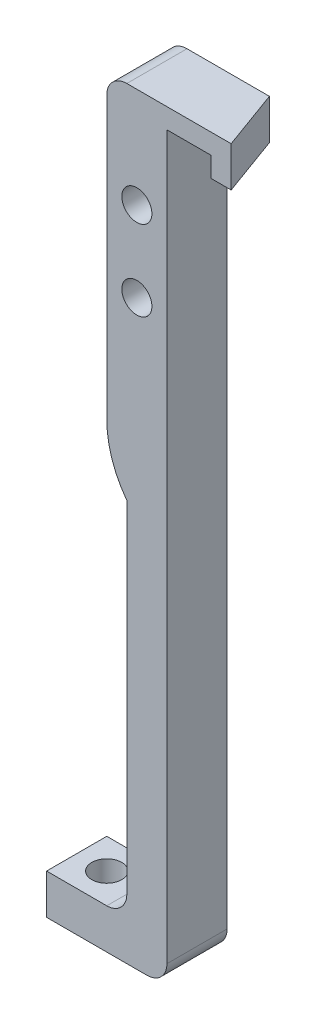
ISO-10303-21;
HEADER;
FILE_DESCRIPTION(('STEP AP214'),'2;1');
FILE_NAME('part.step','',(''),(''),'','','');
FILE_SCHEMA(('AUTOMOTIVE_DESIGN { 1 0 10303 214 1 1 1 1 }'));
ENDSEC;
DATA;
#1=APPLICATION_CONTEXT('core data for automotive mechanical design processes');
#2=APPLICATION_PROTOCOL_DEFINITION('international standard','automotive_design',2000,#1);
#3=PRODUCT_CONTEXT('',#1,'mechanical');
#4=PRODUCT('Part','Part','',(#3));
#5=PRODUCT_RELATED_PRODUCT_CATEGORY('part','',(#4));
#6=PRODUCT_DEFINITION_FORMATION('','',#4);
#7=PRODUCT_DEFINITION_CONTEXT('part definition',#1,'design');
#8=PRODUCT_DEFINITION('design','',#6,#7);
#9=PRODUCT_DEFINITION_SHAPE('','',#8);
#10=(LENGTH_UNIT() NAMED_UNIT(*) SI_UNIT(.MILLI.,.METRE.));
#11=(NAMED_UNIT(*) PLANE_ANGLE_UNIT() SI_UNIT($,.RADIAN.));
#12=(NAMED_UNIT(*) SI_UNIT($,.STERADIAN.) SOLID_ANGLE_UNIT());
#13=UNCERTAINTY_MEASURE_WITH_UNIT(LENGTH_MEASURE(1.E-05),#10,'distance_accuracy_value','');
#14=(GEOMETRIC_REPRESENTATION_CONTEXT(3) GLOBAL_UNCERTAINTY_ASSIGNED_CONTEXT((#13)) GLOBAL_UNIT_ASSIGNED_CONTEXT((#10,
#11,#12)) REPRESENTATION_CONTEXT('',''));
#15=CARTESIAN_POINT('',(0.,0.,0.));
#16=DIRECTION('',(0.,0.,1.));
#17=DIRECTION('',(1.,0.,0.));
#18=AXIS2_PLACEMENT_3D('',#15,#16,#17);
#19=CARTESIAN_POINT('',(15.748,93.98,0.));
#20=DIRECTION('',(0.,1.,0.));
#21=DIRECTION('',(0.,0.,1.));
#22=AXIS2_PLACEMENT_3D('',#19,#20,#21);
#23=PLANE('',#22);
#24=DIRECTION('',(-0.342020143325663,0.,-0.93969262078591));
#25=VECTOR('',#24,1.);
#26=CARTESIAN_POINT('',(10.4345468148915,93.98,-7.62));
#27=LINE('',#26,#25);
#28=CARTESIAN_POINT('',(13.2079999999999,93.98,0.));
#29=VERTEX_POINT('',#28);
#30=CARTESIAN_POINT('',(10.4345468148915,93.98,-7.62));
#31=VERTEX_POINT('',#30);
#32=EDGE_CURVE('E179',#29,#31,#27,.T.);
#33=ORIENTED_EDGE('',*,*,#32,.F.);
#34=DIRECTION('',(-1.,0.,0.));
#35=VECTOR('',#34,1.);
#36=CARTESIAN_POINT('',(15.748,93.98,0.));
#37=LINE('',#36,#35);
#38=CARTESIAN_POINT('',(7.62,93.9799999999999,0.));
#39=VERTEX_POINT('',#38);
#40=EDGE_CURVE('E221',#29,#39,#37,.T.);
#41=ORIENTED_EDGE('',*,*,#40,.T.);
#42=DIRECTION('',(0.,0.,-1.));
#43=VECTOR('',#42,1.);
#44=CARTESIAN_POINT('',(7.62,93.98,0.));
#45=LINE('',#44,#43);
#46=CARTESIAN_POINT('',(7.62,93.98,-7.62));
#47=VERTEX_POINT('',#46);
#48=EDGE_CURVE('E200',#39,#47,#45,.T.);
#49=ORIENTED_EDGE('',*,*,#48,.T.);
#50=DIRECTION('',(-1.,0.,0.));
#51=VECTOR('',#50,1.);
#52=CARTESIAN_POINT('',(15.748,93.98,-7.62));
#53=LINE('',#52,#51);
#54=EDGE_CURVE('E203',#31,#47,#53,.T.);
#55=ORIENTED_EDGE('',*,*,#54,.F.);
#56=EDGE_LOOP('',(#33,#41,#49,#55));
#57=FACE_BOUND('',#56,.T.);
#58=ADVANCED_FACE('F33',(#57),#23,.F.);
#59=CARTESIAN_POINT('',(7.62,0.,0.));
#60=DIRECTION('',(-1.,0.,0.));
#61=DIRECTION('',(0.,0.,1.));
#62=AXIS2_PLACEMENT_3D('',#59,#60,#61);
#63=PLANE('',#62);
#64=DIRECTION('',(0.,-1.,0.));
#65=VECTOR('',#64,1.);
#66=CARTESIAN_POINT('',(7.62,0.,0.));
#67=LINE('',#66,#65);
#68=CARTESIAN_POINT('',(7.62,2.54,0.));
#69=VERTEX_POINT('',#68);
#70=EDGE_CURVE('E212',#39,#69,#67,.T.);
#71=ORIENTED_EDGE('',*,*,#70,.T.);
#72=DIRECTION('',(0.,0.,-1.));
#73=VECTOR('',#72,1.);
#74=CARTESIAN_POINT('',(7.62,2.54,0.));
#75=LINE('',#74,#73);
#76=CARTESIAN_POINT('',(7.62,2.54,-7.62));
#77=VERTEX_POINT('',#76);
#78=EDGE_CURVE('E162',#69,#77,#75,.T.);
#79=ORIENTED_EDGE('',*,*,#78,.T.);
#80=DIRECTION('',(0.,1.,0.));
#81=VECTOR('',#80,1.);
#82=CARTESIAN_POINT('',(7.62,0.,-7.62));
#83=LINE('',#82,#81);
#84=EDGE_CURVE('E237',#77,#47,#83,.T.);
#85=ORIENTED_EDGE('',*,*,#84,.T.);
#86=ORIENTED_EDGE('',*,*,#48,.F.);
#87=EDGE_LOOP('',(#71,#79,#85,#86));
#88=FACE_BOUND('',#87,.T.);
#89=ADVANCED_FACE('F290',(#88),#63,.F.);
#90=CARTESIAN_POINT('',(7.62,0.,0.));
#91=DIRECTION('',(0.,0.,-1.));
#92=DIRECTION('',(-1.,0.,0.));
#93=AXIS2_PLACEMENT_3D('',#90,#91,#92);
#94=PLANE('',#93);
#95=CARTESIAN_POINT('',(3.81,73.66,0.));
#96=DIRECTION('',(0.,0.,1.));
#97=DIRECTION('',(1.,0.,0.));
#98=AXIS2_PLACEMENT_3D('',#95,#96,#97);
#99=CIRCLE('',#98,1.90500000000001);
#100=CARTESIAN_POINT('',(5.71500000000001,73.66,0.));
#101=VERTEX_POINT('',#100);
#102=EDGE_CURVE('E279',#101,#101,#99,.T.);
#103=ORIENTED_EDGE('',*,*,#102,.F.);
#104=EDGE_LOOP('',(#103));
#105=FACE_BOUND('',#104,.T.);
#106=CARTESIAN_POINT('',(3.81,83.82,0.));
#107=DIRECTION('',(0.,0.,1.));
#108=DIRECTION('',(1.,0.,0.));
#109=AXIS2_PLACEMENT_3D('',#106,#107,#108);
#110=CIRCLE('',#109,1.90500000000001);
#111=CARTESIAN_POINT('',(5.71500000000001,83.82,0.));
#112=VERTEX_POINT('',#111);
#113=EDGE_CURVE('E271',#112,#112,#110,.T.);
#114=ORIENTED_EDGE('',*,*,#113,.F.);
#115=EDGE_LOOP('',(#114));
#116=FACE_BOUND('',#115,.T.);
#117=DIRECTION('',(-1.,0.,0.));
#118=VECTOR('',#117,1.);
#119=CARTESIAN_POINT('',(7.62,0.,0.));
#120=LINE('',#119,#118);
#121=CARTESIAN_POINT('',(5.08,0.,0.));
#122=VERTEX_POINT('',#121);
#123=CARTESIAN_POINT('',(-7.62,0.,0.));
#124=VERTEX_POINT('',#123);
#125=EDGE_CURVE('E242',#122,#124,#120,.T.);
#126=ORIENTED_EDGE('',*,*,#125,.F.);
#127=CARTESIAN_POINT('',(5.08,2.54,0.));
#128=DIRECTION('',(0.,0.,-1.));
#129=DIRECTION('',(-1.,0.,0.));
#130=AXIS2_PLACEMENT_3D('',#127,#128,#129);
#131=CIRCLE('',#130,2.54);
#132=EDGE_CURVE('E260',#122,#69,#131,.F.);
#133=ORIENTED_EDGE('',*,*,#132,.T.);
#134=ORIENTED_EDGE('',*,*,#70,.F.);
#135=ORIENTED_EDGE('',*,*,#40,.F.);
#136=DIRECTION('',(0.,1.,0.));
#137=VECTOR('',#136,1.);
#138=CARTESIAN_POINT('',(13.2079999999999,91.44,0.));
#139=LINE('',#138,#137);
#140=CARTESIAN_POINT('',(13.2079999999999,91.44,0.));
#141=VERTEX_POINT('',#140);
#142=EDGE_CURVE('E197',#141,#29,#139,.T.);
#143=ORIENTED_EDGE('',*,*,#142,.F.);
#144=DIRECTION('',(-1.,0.,0.));
#145=VECTOR('',#144,1.);
#146=CARTESIAN_POINT('',(15.748,91.44,0.));
#147=LINE('',#146,#145);
#148=CARTESIAN_POINT('',(15.748,91.44,0.));
#149=VERTEX_POINT('',#148);
#150=EDGE_CURVE('E180',#149,#141,#147,.T.);
#151=ORIENTED_EDGE('',*,*,#150,.F.);
#152=DIRECTION('',(0.,-1.,0.));
#153=VECTOR('',#152,1.);
#154=CARTESIAN_POINT('',(15.748,96.52,0.));
#155=LINE('',#154,#153);
#156=CARTESIAN_POINT('',(15.748,96.52,0.));
#157=VERTEX_POINT('',#156);
#158=EDGE_CURVE('E201',#157,#149,#155,.T.);
#159=ORIENTED_EDGE('',*,*,#158,.F.);
#160=DIRECTION('',(-1.,0.,0.));
#161=VECTOR('',#160,1.);
#162=CARTESIAN_POINT('',(7.62,96.52,0.));
#163=LINE('',#162,#161);
#164=CARTESIAN_POINT('',(2.54,96.52,0.));
#165=VERTEX_POINT('',#164);
#166=EDGE_CURVE('E233',#157,#165,#163,.T.);
#167=ORIENTED_EDGE('',*,*,#166,.T.);
#168=CARTESIAN_POINT('',(2.54,93.98,0.));
#169=DIRECTION('',(0.,0.,-1.));
#170=DIRECTION('',(-1.,0.,0.));
#171=AXIS2_PLACEMENT_3D('',#168,#169,#170);
#172=CIRCLE('',#171,2.54);
#173=CARTESIAN_POINT('',(0.,93.98,0.));
#174=VERTEX_POINT('',#173);
#175=EDGE_CURVE('E50',#165,#174,#172,.F.);
#176=ORIENTED_EDGE('',*,*,#175,.T.);
#177=DIRECTION('',(0.,-1.,0.));
#178=VECTOR('',#177,1.);
#179=CARTESIAN_POINT('',(0.,0.,0.));
#180=LINE('',#179,#178);
#181=CARTESIAN_POINT('',(0.,58.42,0.));
#182=VERTEX_POINT('',#181);
#183=EDGE_CURVE('E158',#174,#182,#180,.T.);
#184=ORIENTED_EDGE('',*,*,#183,.T.);
#185=CARTESIAN_POINT('',(12.7,58.42,0.));
#186=DIRECTION('',(0.,0.,-1.));
#187=DIRECTION('',(-1.,0.,0.));
#188=AXIS2_PLACEMENT_3D('',#185,#186,#187);
#189=CIRCLE('',#188,12.7);
#190=CARTESIAN_POINT('',(2.54,50.8,0.));
#191=VERTEX_POINT('',#190);
#192=EDGE_CURVE('E154',#182,#191,#189,.F.);
#193=ORIENTED_EDGE('',*,*,#192,.T.);
#194=DIRECTION('',(0.,1.,0.));
#195=VECTOR('',#194,1.);
#196=CARTESIAN_POINT('',(2.54,5.08,0.));
#197=LINE('',#196,#195);
#198=CARTESIAN_POINT('',(2.54,7.62,0.));
#199=VERTEX_POINT('',#198);
#200=EDGE_CURVE('E142',#199,#191,#197,.T.);
#201=ORIENTED_EDGE('',*,*,#200,.F.);
#202=CARTESIAN_POINT('',(0.,7.62,0.));
#203=DIRECTION('',(0.,0.,-1.));
#204=DIRECTION('',(-1.,0.,0.));
#205=AXIS2_PLACEMENT_3D('',#202,#203,#204);
#206=CIRCLE('',#205,2.54);
#207=CARTESIAN_POINT('',(0.,5.08,0.));
#208=VERTEX_POINT('',#207);
#209=EDGE_CURVE('E42',#199,#208,#206,.T.);
#210=ORIENTED_EDGE('',*,*,#209,.T.);
#211=DIRECTION('',(1.,0.,0.));
#212=VECTOR('',#211,1.);
#213=CARTESIAN_POINT('',(-7.62,5.08,0.));
#214=LINE('',#213,#212);
#215=CARTESIAN_POINT('',(-7.62,5.08,0.));
#216=VERTEX_POINT('',#215);
#217=EDGE_CURVE('E247',#216,#208,#214,.T.);
#218=ORIENTED_EDGE('',*,*,#217,.F.);
#219=DIRECTION('',(0.,1.,0.));
#220=VECTOR('',#219,1.);
#221=CARTESIAN_POINT('',(-7.62,0.,0.));
#222=LINE('',#221,#220);
#223=EDGE_CURVE('E206',#124,#216,#222,.T.);
#224=ORIENTED_EDGE('',*,*,#223,.F.);
#225=EDGE_LOOP('',(#126,#133,#134,#135,#143,#151,#159,#167,#176,#184,#193,#201,#210,#218,#224));
#226=FACE_BOUND('',#225,.T.);
#227=ADVANCED_FACE('F156',(#105,#116,#226),#94,.F.);
#228=CARTESIAN_POINT('',(7.62,0.,0.));
#229=DIRECTION('',(0.,1.,0.));
#230=DIRECTION('',(0.,0.,1.));
#231=AXIS2_PLACEMENT_3D('',#228,#229,#230);
#232=PLANE('',#231);
#233=CARTESIAN_POINT('',(-3.81,0.,-3.81));
#234=DIRECTION('',(0.,1.,0.));
#235=DIRECTION('',(0.,0.,1.));
#236=AXIS2_PLACEMENT_3D('',#233,#234,#235);
#237=CIRCLE('',#236,1.89865);
#238=CARTESIAN_POINT('',(-3.81,0.,-1.91135));
#239=VERTEX_POINT('',#238);
#240=EDGE_CURVE('E176',#239,#239,#237,.T.);
#241=ORIENTED_EDGE('',*,*,#240,.T.);
#242=EDGE_LOOP('',(#241));
#243=FACE_BOUND('',#242,.T.);
#244=DIRECTION('',(-1.,0.,0.));
#245=VECTOR('',#244,1.);
#246=CARTESIAN_POINT('',(7.62,0.,-7.62));
#247=LINE('',#246,#245);
#248=CARTESIAN_POINT('',(5.08,0.,-7.62));
#249=VERTEX_POINT('',#248);
#250=CARTESIAN_POINT('',(-7.62,0.,-7.62));
#251=VERTEX_POINT('',#250);
#252=EDGE_CURVE('E240',#249,#251,#247,.T.);
#253=ORIENTED_EDGE('',*,*,#252,.F.);
#254=DIRECTION('',(0.,0.,-1.));
#255=VECTOR('',#254,1.);
#256=CARTESIAN_POINT('',(5.08,0.,0.));
#257=LINE('',#256,#255);
#258=EDGE_CURVE('E257',#249,#122,#257,.F.);
#259=ORIENTED_EDGE('',*,*,#258,.T.);
#260=ORIENTED_EDGE('',*,*,#125,.T.);
#261=DIRECTION('',(0.,0.,1.));
#262=VECTOR('',#261,1.);
#263=CARTESIAN_POINT('',(-7.62,0.,0.));
#264=LINE('',#263,#262);
#265=EDGE_CURVE('E248',#251,#124,#264,.T.);
#266=ORIENTED_EDGE('',*,*,#265,.F.);
#267=EDGE_LOOP('',(#253,#259,#260,#266));
#268=FACE_BOUND('',#267,.T.);
#269=ADVANCED_FACE('F289',(#243,#268),#232,.F.);
#270=CARTESIAN_POINT('',(7.62,0.,-7.62));
#271=DIRECTION('',(0.,0.,1.));
#272=DIRECTION('',(1.,0.,0.));
#273=AXIS2_PLACEMENT_3D('',#270,#271,#272);
#274=PLANE('',#273);
#275=CARTESIAN_POINT('',(3.81,73.66,-7.62));
#276=DIRECTION('',(0.,0.,1.));
#277=DIRECTION('',(1.,0.,0.));
#278=AXIS2_PLACEMENT_3D('',#275,#276,#277);
#279=CIRCLE('',#278,1.90500000000001);
#280=CARTESIAN_POINT('',(5.71500000000001,73.66,-7.62));
#281=VERTEX_POINT('',#280);
#282=EDGE_CURVE('E37',#281,#281,#279,.T.);
#283=ORIENTED_EDGE('',*,*,#282,.T.);
#284=EDGE_LOOP('',(#283));
#285=FACE_BOUND('',#284,.T.);
#286=CARTESIAN_POINT('',(3.81,83.82,-7.62));
#287=DIRECTION('',(0.,0.,1.));
#288=DIRECTION('',(1.,0.,0.));
#289=AXIS2_PLACEMENT_3D('',#286,#287,#288);
#290=CIRCLE('',#289,1.90500000000001);
#291=CARTESIAN_POINT('',(5.71500000000001,83.82,-7.62));
#292=VERTEX_POINT('',#291);
#293=EDGE_CURVE('E269',#292,#292,#290,.T.);
#294=ORIENTED_EDGE('',*,*,#293,.T.);
#295=EDGE_LOOP('',(#294));
#296=FACE_BOUND('',#295,.T.);
#297=ORIENTED_EDGE('',*,*,#84,.F.);
#298=CARTESIAN_POINT('',(5.08,2.54,-7.62));
#299=DIRECTION('',(0.,0.,1.));
#300=DIRECTION('',(1.,0.,0.));
#301=AXIS2_PLACEMENT_3D('',#298,#299,#300);
#302=CIRCLE('',#301,2.54);
#303=EDGE_CURVE('E334',#77,#249,#302,.F.);
#304=ORIENTED_EDGE('',*,*,#303,.T.);
#305=ORIENTED_EDGE('',*,*,#252,.T.);
#306=DIRECTION('',(0.,-1.,0.));
#307=VECTOR('',#306,1.);
#308=CARTESIAN_POINT('',(-7.62,0.,-7.62));
#309=LINE('',#308,#307);
#310=CARTESIAN_POINT('',(-7.62,5.08,-7.62));
#311=VERTEX_POINT('',#310);
#312=EDGE_CURVE('E347',#311,#251,#309,.T.);
#313=ORIENTED_EDGE('',*,*,#312,.F.);
#314=DIRECTION('',(1.,0.,0.));
#315=VECTOR('',#314,1.);
#316=CARTESIAN_POINT('',(-7.62,5.08,-7.62));
#317=LINE('',#316,#315);
#318=CARTESIAN_POINT('',(0.,5.08,-7.62));
#319=VERTEX_POINT('',#318);
#320=EDGE_CURVE('E244',#311,#319,#317,.T.);
#321=ORIENTED_EDGE('',*,*,#320,.T.);
#322=CARTESIAN_POINT('',(0.,7.62,-7.62));
#323=DIRECTION('',(0.,0.,1.));
#324=DIRECTION('',(1.,0.,0.));
#325=AXIS2_PLACEMENT_3D('',#322,#323,#324);
#326=CIRCLE('',#325,2.54);
#327=CARTESIAN_POINT('',(2.54,7.62,-7.62));
#328=VERTEX_POINT('',#327);
#329=EDGE_CURVE('E11',#319,#328,#326,.T.);
#330=ORIENTED_EDGE('',*,*,#329,.T.);
#331=DIRECTION('',(0.,-1.,0.));
#332=VECTOR('',#331,1.);
#333=CARTESIAN_POINT('',(2.54,5.08,-7.62));
#334=LINE('',#333,#332);
#335=CARTESIAN_POINT('',(2.54,50.8,-7.62));
#336=VERTEX_POINT('',#335);
#337=EDGE_CURVE('E151',#336,#328,#334,.T.);
#338=ORIENTED_EDGE('',*,*,#337,.F.);
#339=CARTESIAN_POINT('',(12.7,58.42,-7.62));
#340=DIRECTION('',(0.,0.,1.));
#341=DIRECTION('',(1.,0.,0.));
#342=AXIS2_PLACEMENT_3D('',#339,#340,#341);
#343=CIRCLE('',#342,12.7);
#344=CARTESIAN_POINT('',(0.,58.42,-7.62));
#345=VERTEX_POINT('',#344);
#346=EDGE_CURVE('E166',#336,#345,#343,.F.);
#347=ORIENTED_EDGE('',*,*,#346,.T.);
#348=DIRECTION('',(0.,1.,0.));
#349=VECTOR('',#348,1.);
#350=CARTESIAN_POINT('',(0.,0.,-7.62));
#351=LINE('',#350,#349);
#352=CARTESIAN_POINT('',(0.,93.98,-7.62));
#353=VERTEX_POINT('',#352);
#354=EDGE_CURVE('E223',#345,#353,#351,.T.);
#355=ORIENTED_EDGE('',*,*,#354,.T.);
#356=CARTESIAN_POINT('',(2.54,93.98,-7.62));
#357=DIRECTION('',(0.,0.,1.));
#358=DIRECTION('',(1.,0.,0.));
#359=AXIS2_PLACEMENT_3D('',#356,#357,#358);
#360=CIRCLE('',#359,2.54);
#361=CARTESIAN_POINT('',(2.54,96.52,-7.62));
#362=VERTEX_POINT('',#361);
#363=EDGE_CURVE('E361',#353,#362,#360,.F.);
#364=ORIENTED_EDGE('',*,*,#363,.T.);
#365=DIRECTION('',(-1.,0.,0.));
#366=VECTOR('',#365,1.);
#367=CARTESIAN_POINT('',(7.62,96.52,-7.62));
#368=LINE('',#367,#366);
#369=CARTESIAN_POINT('',(12.9745468148915,96.52,-7.62));
#370=VERTEX_POINT('',#369);
#371=EDGE_CURVE('E236',#370,#362,#368,.T.);
#372=ORIENTED_EDGE('',*,*,#371,.F.);
#373=DIRECTION('',(0.,1.,0.));
#374=VECTOR('',#373,1.);
#375=CARTESIAN_POINT('',(12.9745468148915,91.44,-7.62));
#376=LINE('',#375,#374);
#377=CARTESIAN_POINT('',(12.9745468148915,91.44,-7.62));
#378=VERTEX_POINT('',#377);
#379=EDGE_CURVE('E190',#378,#370,#376,.T.);
#380=ORIENTED_EDGE('',*,*,#379,.F.);
#381=DIRECTION('',(1.,0.,0.));
#382=VECTOR('',#381,1.);
#383=CARTESIAN_POINT('',(10.4345468148915,91.44,-7.62));
#384=LINE('',#383,#382);
#385=CARTESIAN_POINT('',(10.4345468148915,91.44,-7.62));
#386=VERTEX_POINT('',#385);
#387=EDGE_CURVE('E185',#386,#378,#384,.T.);
#388=ORIENTED_EDGE('',*,*,#387,.F.);
#389=DIRECTION('',(0.,1.,0.));
#390=VECTOR('',#389,1.);
#391=CARTESIAN_POINT('',(10.4345468148915,91.44,-7.62));
#392=LINE('',#391,#390);
#393=EDGE_CURVE('E194',#386,#31,#392,.T.);
#394=ORIENTED_EDGE('',*,*,#393,.T.);
#395=ORIENTED_EDGE('',*,*,#54,.T.);
#396=EDGE_LOOP('',(#297,#304,#305,#313,#321,#330,#338,#347,#355,#364,#372,#380,#388,#394,#395));
#397=FACE_BOUND('',#396,.T.);
#398=ADVANCED_FACE('F296',(#285,#296,#397),#274,.F.);
#399=CARTESIAN_POINT('',(7.62,96.52,0.));
#400=DIRECTION('',(0.,-1.,0.));
#401=DIRECTION('',(0.,0.,-1.));
#402=AXIS2_PLACEMENT_3D('',#399,#400,#401);
#403=PLANE('',#402);
#404=ORIENTED_EDGE('',*,*,#371,.T.);
#405=DIRECTION('',(0.,0.,1.));
#406=VECTOR('',#405,1.);
#407=CARTESIAN_POINT('',(2.54,96.52,0.));
#408=LINE('',#407,#406);
#409=EDGE_CURVE('E262',#362,#165,#408,.T.);
#410=ORIENTED_EDGE('',*,*,#409,.T.);
#411=ORIENTED_EDGE('',*,*,#166,.F.);
#412=DIRECTION('',(-0.342020143325669,0.,-0.939692620785908));
#413=VECTOR('',#412,1.);
#414=CARTESIAN_POINT('',(12.9745468148915,96.52,-7.62));
#415=LINE('',#414,#413);
#416=EDGE_CURVE('E167',#157,#370,#415,.T.);
#417=ORIENTED_EDGE('',*,*,#416,.T.);
#418=EDGE_LOOP('',(#404,#410,#411,#417));
#419=FACE_BOUND('',#418,.T.);
#420=ADVANCED_FACE('F322',(#419),#403,.F.);
#421=CARTESIAN_POINT('',(0.,0.,0.));
#422=DIRECTION('',(-1.,0.,0.));
#423=DIRECTION('',(0.,0.,1.));
#424=AXIS2_PLACEMENT_3D('',#421,#422,#423);
#425=PLANE('',#424);
#426=ORIENTED_EDGE('',*,*,#183,.F.);
#427=DIRECTION('',(0.,0.,1.));
#428=VECTOR('',#427,1.);
#429=CARTESIAN_POINT('',(0.,93.98,-7.62));
#430=LINE('',#429,#428);
#431=EDGE_CURVE('E264',#174,#353,#430,.F.);
#432=ORIENTED_EDGE('',*,*,#431,.T.);
#433=ORIENTED_EDGE('',*,*,#354,.F.);
#434=DIRECTION('',(0.,0.,1.));
#435=VECTOR('',#434,1.);
#436=CARTESIAN_POINT('',(0.,58.42,0.));
#437=LINE('',#436,#435);
#438=EDGE_CURVE('E163',#345,#182,#437,.T.);
#439=ORIENTED_EDGE('',*,*,#438,.T.);
#440=EDGE_LOOP('',(#426,#432,#433,#439));
#441=FACE_BOUND('',#440,.T.);
#442=ADVANCED_FACE('F317',(#441),#425,.T.);
#443=CARTESIAN_POINT('',(-7.62,5.08,0.));
#444=DIRECTION('',(0.,-1.,0.));
#445=DIRECTION('',(0.,0.,-1.));
#446=AXIS2_PLACEMENT_3D('',#443,#444,#445);
#447=PLANE('',#446);
#448=CARTESIAN_POINT('',(-3.81,5.08,-3.81));
#449=DIRECTION('',(0.,1.,0.));
#450=DIRECTION('',(0.,0.,1.));
#451=AXIS2_PLACEMENT_3D('',#448,#449,#450);
#452=CIRCLE('',#451,1.89865);
#453=CARTESIAN_POINT('',(-3.81,5.08,-1.91135));
#454=VERTEX_POINT('',#453);
#455=EDGE_CURVE('E170',#454,#454,#452,.T.);
#456=ORIENTED_EDGE('',*,*,#455,.F.);
#457=EDGE_LOOP('',(#456));
#458=FACE_BOUND('',#457,.T.);
#459=ORIENTED_EDGE('',*,*,#217,.T.);
#460=DIRECTION('',(0.,0.,1.));
#461=VECTOR('',#460,1.);
#462=CARTESIAN_POINT('',(0.,5.08,-7.62));
#463=LINE('',#462,#461);
#464=EDGE_CURVE('E267',#208,#319,#463,.F.);
#465=ORIENTED_EDGE('',*,*,#464,.T.);
#466=ORIENTED_EDGE('',*,*,#320,.F.);
#467=DIRECTION('',(0.,0.,-1.));
#468=VECTOR('',#467,1.);
#469=CARTESIAN_POINT('',(-7.62,5.08,0.));
#470=LINE('',#469,#468);
#471=EDGE_CURVE('E349',#216,#311,#470,.T.);
#472=ORIENTED_EDGE('',*,*,#471,.F.);
#473=EDGE_LOOP('',(#459,#465,#466,#472));
#474=FACE_BOUND('',#473,.T.);
#475=ADVANCED_FACE('F314',(#458,#474),#447,.F.);
#476=CARTESIAN_POINT('',(-7.62,0.,0.));
#477=DIRECTION('',(-1.,0.,0.));
#478=DIRECTION('',(0.,0.,1.));
#479=AXIS2_PLACEMENT_3D('',#476,#477,#478);
#480=PLANE('',#479);
#481=ORIENTED_EDGE('',*,*,#223,.T.);
#482=ORIENTED_EDGE('',*,*,#471,.T.);
#483=ORIENTED_EDGE('',*,*,#312,.T.);
#484=ORIENTED_EDGE('',*,*,#265,.T.);
#485=EDGE_LOOP('',(#481,#482,#483,#484));
#486=FACE_BOUND('',#485,.T.);
#487=ADVANCED_FACE('F311',(#486),#480,.T.);
#488=CARTESIAN_POINT('',(10.4345468148915,91.44,-7.62));
#489=DIRECTION('',(0.939692620785911,0.,-0.342020143325663));
#490=DIRECTION('',(-0.342020143325663,0.,-0.939692620785911));
#491=AXIS2_PLACEMENT_3D('',#488,#489,#490);
#492=PLANE('',#491);
#493=ORIENTED_EDGE('',*,*,#32,.T.);
#494=ORIENTED_EDGE('',*,*,#393,.F.);
#495=DIRECTION('',(-0.342020143325663,0.,-0.93969262078591));
#496=VECTOR('',#495,1.);
#497=CARTESIAN_POINT('',(10.4345468148915,91.44,-7.62));
#498=LINE('',#497,#496);
#499=EDGE_CURVE('E183',#141,#386,#498,.T.);
#500=ORIENTED_EDGE('',*,*,#499,.F.);
#501=ORIENTED_EDGE('',*,*,#142,.T.);
#502=EDGE_LOOP('',(#493,#494,#500,#501));
#503=FACE_BOUND('',#502,.T.);
#504=ADVANCED_FACE('F309',(#503),#492,.F.);
#505=CARTESIAN_POINT('',(15.748,91.44,0.));
#506=DIRECTION('',(-0.939692620785908,0.,0.342020143325669));
#507=DIRECTION('',(0.342020143325669,0.,0.939692620785908));
#508=AXIS2_PLACEMENT_3D('',#505,#506,#507);
#509=PLANE('',#508);
#510=ORIENTED_EDGE('',*,*,#379,.T.);
#511=ORIENTED_EDGE('',*,*,#416,.F.);
#512=ORIENTED_EDGE('',*,*,#158,.T.);
#513=DIRECTION('',(0.342020143325669,0.,0.939692620785908));
#514=VECTOR('',#513,1.);
#515=CARTESIAN_POINT('',(15.748,91.44,0.));
#516=LINE('',#515,#514);
#517=EDGE_CURVE('E187',#378,#149,#516,.T.);
#518=ORIENTED_EDGE('',*,*,#517,.F.);
#519=EDGE_LOOP('',(#510,#511,#512,#518));
#520=FACE_BOUND('',#519,.T.);
#521=ADVANCED_FACE('F394',(#520),#509,.F.);
#522=CARTESIAN_POINT('',(0.,91.44,0.));
#523=DIRECTION('',(0.,1.,0.));
#524=DIRECTION('',(0.,0.,1.));
#525=AXIS2_PLACEMENT_3D('',#522,#523,#524);
#526=PLANE('',#525);
#527=ORIENTED_EDGE('',*,*,#150,.T.);
#528=ORIENTED_EDGE('',*,*,#499,.T.);
#529=ORIENTED_EDGE('',*,*,#387,.T.);
#530=ORIENTED_EDGE('',*,*,#517,.T.);
#531=EDGE_LOOP('',(#527,#528,#529,#530));
#532=FACE_BOUND('',#531,.T.);
#533=ADVANCED_FACE('F388',(#532),#526,.F.);
#534=CARTESIAN_POINT('',(-3.81,5.08,-3.81));
#535=DIRECTION('',(0.,1.,0.));
#536=DIRECTION('',(0.,0.,1.));
#537=AXIS2_PLACEMENT_3D('',#534,#535,#536);
#538=CYLINDRICAL_SURFACE('',#537,1.89865);
#539=ORIENTED_EDGE('',*,*,#240,.F.);
#540=EDGE_LOOP('',(#539));
#541=FACE_BOUND('',#540,.T.);
#542=ORIENTED_EDGE('',*,*,#455,.T.);
#543=EDGE_LOOP('',(#542));
#544=FACE_BOUND('',#543,.T.);
#545=ADVANCED_FACE('F383',(#541,#544),#538,.F.);
#546=CARTESIAN_POINT('',(2.54,0.,0.));
#547=DIRECTION('',(1.,0.,0.));
#548=DIRECTION('',(0.,0.,-1.));
#549=AXIS2_PLACEMENT_3D('',#546,#547,#548);
#550=PLANE('',#549);
#551=ORIENTED_EDGE('',*,*,#337,.T.);
#552=DIRECTION('',(0.,0.,1.));
#553=VECTOR('',#552,1.);
#554=CARTESIAN_POINT('',(2.54,7.62,0.));
#555=LINE('',#554,#553);
#556=EDGE_CURVE('E150',#328,#199,#555,.T.);
#557=ORIENTED_EDGE('',*,*,#556,.T.);
#558=ORIENTED_EDGE('',*,*,#200,.T.);
#559=DIRECTION('',(0.,0.,-1.));
#560=VECTOR('',#559,1.);
#561=CARTESIAN_POINT('',(2.54,50.8,-7.62));
#562=LINE('',#561,#560);
#563=EDGE_CURVE('E147',#191,#336,#562,.T.);
#564=ORIENTED_EDGE('',*,*,#563,.T.);
#565=EDGE_LOOP('',(#551,#557,#558,#564));
#566=FACE_BOUND('',#565,.T.);
#567=ADVANCED_FACE('F145',(#566),#550,.F.);
#568=CARTESIAN_POINT('',(12.7,58.42,-7.62));
#569=DIRECTION('',(0.,0.,-1.));
#570=DIRECTION('',(-1.,0.,0.));
#571=AXIS2_PLACEMENT_3D('',#568,#569,#570);
#572=CYLINDRICAL_SURFACE('',#571,12.7);
#573=ORIENTED_EDGE('',*,*,#192,.F.);
#574=ORIENTED_EDGE('',*,*,#438,.F.);
#575=ORIENTED_EDGE('',*,*,#346,.F.);
#576=ORIENTED_EDGE('',*,*,#563,.F.);
#577=EDGE_LOOP('',(#573,#574,#575,#576));
#578=FACE_BOUND('',#577,.T.);
#579=ADVANCED_FACE('F165',(#578),#572,.T.);
#580=CARTESIAN_POINT('',(5.08,2.54,0.));
#581=DIRECTION('',(0.,0.,-1.));
#582=DIRECTION('',(-1.,0.,0.));
#583=AXIS2_PLACEMENT_3D('',#580,#581,#582);
#584=CYLINDRICAL_SURFACE('',#583,2.54);
#585=ORIENTED_EDGE('',*,*,#132,.F.);
#586=ORIENTED_EDGE('',*,*,#258,.F.);
#587=ORIENTED_EDGE('',*,*,#303,.F.);
#588=ORIENTED_EDGE('',*,*,#78,.F.);
#589=EDGE_LOOP('',(#585,#586,#587,#588));
#590=FACE_BOUND('',#589,.T.);
#591=ADVANCED_FACE('F360',(#590),#584,.T.);
#592=CARTESIAN_POINT('',(2.54,93.98,0.));
#593=DIRECTION('',(0.,0.,-1.));
#594=DIRECTION('',(-1.,0.,0.));
#595=AXIS2_PLACEMENT_3D('',#592,#593,#594);
#596=CYLINDRICAL_SURFACE('',#595,2.54);
#597=ORIENTED_EDGE('',*,*,#363,.F.);
#598=ORIENTED_EDGE('',*,*,#431,.F.);
#599=ORIENTED_EDGE('',*,*,#175,.F.);
#600=ORIENTED_EDGE('',*,*,#409,.F.);
#601=EDGE_LOOP('',(#597,#598,#599,#600));
#602=FACE_BOUND('',#601,.T.);
#603=ADVANCED_FACE('F369',(#602),#596,.T.);
#604=CARTESIAN_POINT('',(0.,7.62,0.));
#605=DIRECTION('',(0.,0.,-1.));
#606=DIRECTION('',(0.,1.,0.));
#607=AXIS2_PLACEMENT_3D('',#604,#605,#606);
#608=CYLINDRICAL_SURFACE('',#607,2.54);
#609=ORIENTED_EDGE('',*,*,#329,.F.);
#610=ORIENTED_EDGE('',*,*,#464,.F.);
#611=ORIENTED_EDGE('',*,*,#209,.F.);
#612=ORIENTED_EDGE('',*,*,#556,.F.);
#613=EDGE_LOOP('',(#609,#610,#611,#612));
#614=FACE_BOUND('',#613,.T.);
#615=ADVANCED_FACE('F35',(#614),#608,.F.);
#616=CARTESIAN_POINT('',(3.81,83.82,-7.62005));
#617=DIRECTION('',(0.,0.,1.));
#618=DIRECTION('',(1.,0.,0.));
#619=AXIS2_PLACEMENT_3D('',#616,#617,#618);
#620=CYLINDRICAL_SURFACE('',#619,1.90500000000001);
#621=ORIENTED_EDGE('',*,*,#113,.T.);
#622=EDGE_LOOP('',(#621));
#623=FACE_BOUND('',#622,.T.);
#624=ORIENTED_EDGE('',*,*,#293,.F.);
#625=EDGE_LOOP('',(#624));
#626=FACE_BOUND('',#625,.T.);
#627=ADVANCED_FACE('F368',(#623,#626),#620,.F.);
#628=CARTESIAN_POINT('',(3.81,73.66,-7.62005));
#629=DIRECTION('',(0.,0.,1.));
#630=DIRECTION('',(1.,0.,0.));
#631=AXIS2_PLACEMENT_3D('',#628,#629,#630);
#632=CYLINDRICAL_SURFACE('',#631,1.90500000000001);
#633=ORIENTED_EDGE('',*,*,#102,.T.);
#634=EDGE_LOOP('',(#633));
#635=FACE_BOUND('',#634,.T.);
#636=ORIENTED_EDGE('',*,*,#282,.F.);
#637=EDGE_LOOP('',(#636));
#638=FACE_BOUND('',#637,.T.);
#639=ADVANCED_FACE('F284',(#635,#638),#632,.F.);
#640=CLOSED_SHELL('',(#58,#89,#227,#269,#398,#420,#442,#475,#487,#504,#521,#533,#545,#567,#579,
#591,#603,#615,#627,#639));
#641=MANIFOLD_SOLID_BREP('B2',#640);
#642=ADVANCED_BREP_SHAPE_REPRESENTATION('',(#18,#641),#14);
#643=SHAPE_DEFINITION_REPRESENTATION(#9,#642);
ENDSEC;
END-ISO-10303-21;
